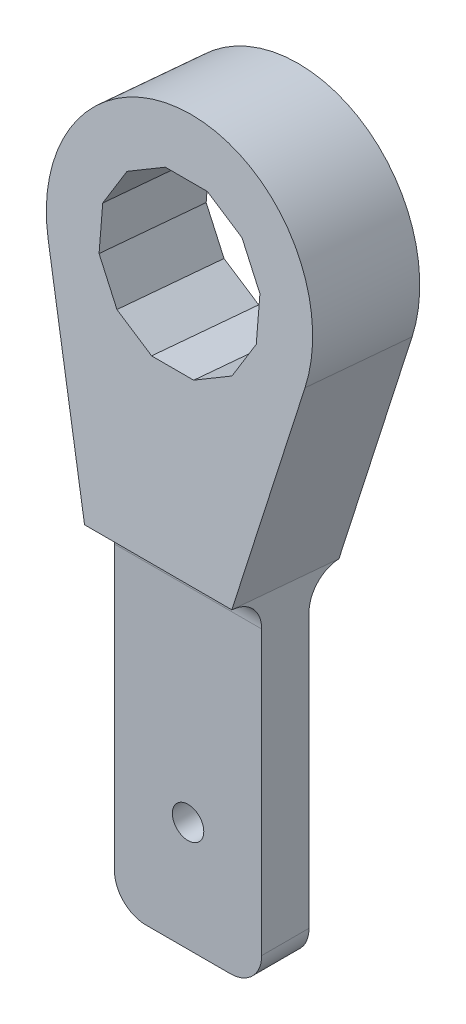
ISO-10303-21;
HEADER;
FILE_DESCRIPTION(('STEP AP214'),'2;1');
FILE_NAME('part.step','',(''),(''),'','','');
FILE_SCHEMA(('AUTOMOTIVE_DESIGN { 1 0 10303 214 1 1 1 1 }'));
ENDSEC;
DATA;
#1=APPLICATION_CONTEXT('core data for automotive mechanical design processes');
#2=APPLICATION_PROTOCOL_DEFINITION('international standard','automotive_design',2000,#1);
#3=PRODUCT_CONTEXT('',#1,'mechanical');
#4=PRODUCT('Part','Part','',(#3));
#5=PRODUCT_RELATED_PRODUCT_CATEGORY('part','',(#4));
#6=PRODUCT_DEFINITION_FORMATION('','',#4);
#7=PRODUCT_DEFINITION_CONTEXT('part definition',#1,'design');
#8=PRODUCT_DEFINITION('design','',#6,#7);
#9=PRODUCT_DEFINITION_SHAPE('','',#8);
#10=(LENGTH_UNIT() NAMED_UNIT(*) SI_UNIT(.MILLI.,.METRE.));
#11=(NAMED_UNIT(*) PLANE_ANGLE_UNIT() SI_UNIT($,.RADIAN.));
#12=(NAMED_UNIT(*) SI_UNIT($,.STERADIAN.) SOLID_ANGLE_UNIT());
#13=UNCERTAINTY_MEASURE_WITH_UNIT(LENGTH_MEASURE(1.E-05),#10,'distance_accuracy_value','');
#14=(GEOMETRIC_REPRESENTATION_CONTEXT(3) GLOBAL_UNCERTAINTY_ASSIGNED_CONTEXT((#13)) GLOBAL_UNIT_ASSIGNED_CONTEXT((#10,
#11,#12)) REPRESENTATION_CONTEXT('',''));
#15=CARTESIAN_POINT('',(0.,0.,0.));
#16=DIRECTION('',(0.,0.,1.));
#17=DIRECTION('',(1.,0.,0.));
#18=AXIS2_PLACEMENT_3D('',#15,#16,#17);
#19=CARTESIAN_POINT('',(10.7188,-57.9254621447862,4.56785703894863));
#20=DIRECTION('',(0.,0.,-1.));
#21=DIRECTION('',(0.,1.,0.));
#22=AXIS2_PLACEMENT_3D('',#19,#20,#21);
#23=PLANE('',#22);
#24=CARTESIAN_POINT('',(0.,-49.0469564859104,4.56785703894864));
#25=DIRECTION('',(0.,0.,1.));
#26=DIRECTION('',(1.,0.,0.));
#27=AXIS2_PLACEMENT_3D('',#24,#25,#26);
#28=CIRCLE('',#27,1.26999999999999);
#29=CARTESIAN_POINT('',(1.26999999999999,-49.0469564859104,4.56785703894864));
#30=VERTEX_POINT('',#29);
#31=EDGE_CURVE('E221',#30,#30,#28,.T.);
#32=ORIENTED_EDGE('',*,*,#31,.F.);
#33=EDGE_LOOP('',(#32));
#34=FACE_BOUND('',#33,.T.);
#35=DIRECTION('',(-1.,0.,0.));
#36=VECTOR('',#35,1.);
#37=CARTESIAN_POINT('',(10.7188,-57.9254621447862,4.56785703894863));
#38=LINE('',#37,#36);
#39=CARTESIAN_POINT('',(3.40995,-57.9254621447862,4.56785703894863));
#40=VERTEX_POINT('',#39);
#41=CARTESIAN_POINT('',(-3.40995,-57.9254621447862,4.56785703894863));
#42=VERTEX_POINT('',#41);
#43=EDGE_CURVE('E350',#40,#42,#38,.T.);
#44=ORIENTED_EDGE('',*,*,#43,.F.);
#45=CARTESIAN_POINT('',(3.40995,-55.3854621447862,4.56785703894864));
#46=DIRECTION('',(0.,0.,-1.));
#47=DIRECTION('',(0.,1.,0.));
#48=AXIS2_PLACEMENT_3D('',#45,#46,#47);
#49=CIRCLE('',#48,2.54);
#50=CARTESIAN_POINT('',(5.94995,-55.3854621447862,4.56785703894863));
#51=VERTEX_POINT('',#50);
#52=EDGE_CURVE('E45',#40,#51,#49,.F.);
#53=ORIENTED_EDGE('',*,*,#52,.T.);
#54=DIRECTION('',(0.,-1.,0.));
#55=VECTOR('',#54,1.);
#56=CARTESIAN_POINT('',(5.94995,-57.9254621447862,4.56785703894863));
#57=LINE('',#56,#55);
#58=CARTESIAN_POINT('',(5.94995,-32.5369564859104,4.56785703894864));
#59=VERTEX_POINT('',#58);
#60=EDGE_CURVE('E238',#59,#51,#57,.T.);
#61=ORIENTED_EDGE('',*,*,#60,.F.);
#62=DIRECTION('',(-1.,0.,0.));
#63=VECTOR('',#62,1.);
#64=CARTESIAN_POINT('',(-5.94995,-32.5369564859104,4.56785703894864));
#65=LINE('',#64,#63);
#66=CARTESIAN_POINT('',(-5.94995,-32.5369564859104,4.56785703894864));
#67=VERTEX_POINT('',#66);
#68=EDGE_CURVE('E360',#59,#67,#65,.T.);
#69=ORIENTED_EDGE('',*,*,#68,.T.);
#70=DIRECTION('',(0.,1.,0.));
#71=VECTOR('',#70,1.);
#72=CARTESIAN_POINT('',(-5.94994999999999,-57.9254621447862,4.56785703894863));
#73=LINE('',#72,#71);
#74=CARTESIAN_POINT('',(-5.94994999999999,-55.3854621447862,4.56785703894863));
#75=VERTEX_POINT('',#74);
#76=EDGE_CURVE('E233',#75,#67,#73,.T.);
#77=ORIENTED_EDGE('',*,*,#76,.F.);
#78=CARTESIAN_POINT('',(-3.40995,-55.3854621447862,4.56785703894863));
#79=DIRECTION('',(0.,0.,-1.));
#80=DIRECTION('',(0.,1.,0.));
#81=AXIS2_PLACEMENT_3D('',#78,#79,#80);
#82=CIRCLE('',#81,2.54);
#83=EDGE_CURVE('E52',#75,#42,#82,.F.);
#84=ORIENTED_EDGE('',*,*,#83,.T.);
#85=EDGE_LOOP('',(#44,#53,#61,#69,#77,#84));
#86=FACE_BOUND('',#85,.T.);
#87=ADVANCED_FACE('F37',(#34,#86),#23,.F.);
#88=CARTESIAN_POINT('',(10.7188,-57.9254621447862,4.56785703894863));
#89=DIRECTION('',(0.,1.,0.));
#90=DIRECTION('',(0.,0.,1.));
#91=AXIS2_PLACEMENT_3D('',#88,#89,#90);
#92=PLANE('',#91);
#93=DIRECTION('',(-1.,0.,0.));
#94=VECTOR('',#93,1.);
#95=CARTESIAN_POINT('',(10.7188,-57.9254621447862,0.745157038948635));
#96=LINE('',#95,#94);
#97=CARTESIAN_POINT('',(3.40995,-57.9254621447862,0.745157038948635));
#98=VERTEX_POINT('',#97);
#99=CARTESIAN_POINT('',(-3.40995,-57.9254621447862,0.745157038948635));
#100=VERTEX_POINT('',#99);
#101=EDGE_CURVE('E347',#98,#100,#96,.T.);
#102=ORIENTED_EDGE('',*,*,#101,.F.);
#103=DIRECTION('',(0.,0.,-1.));
#104=VECTOR('',#103,1.);
#105=CARTESIAN_POINT('',(3.40995,-57.9254621447862,4.56785703894879));
#106=LINE('',#105,#104);
#107=EDGE_CURVE('E383',#98,#40,#106,.F.);
#108=ORIENTED_EDGE('',*,*,#107,.T.);
#109=ORIENTED_EDGE('',*,*,#43,.T.);
#110=DIRECTION('',(0.,0.,1.));
#111=VECTOR('',#110,1.);
#112=CARTESIAN_POINT('',(-3.40995,-57.9254621447862,0.745157038948636));
#113=LINE('',#112,#111);
#114=EDGE_CURVE('E381',#42,#100,#113,.F.);
#115=ORIENTED_EDGE('',*,*,#114,.T.);
#116=EDGE_LOOP('',(#102,#108,#109,#115));
#117=FACE_BOUND('',#116,.T.);
#118=ADVANCED_FACE('F401',(#117),#92,.F.);
#119=CARTESIAN_POINT('',(10.7188,-57.9254621447862,0.745157038948635));
#120=DIRECTION('',(0.,0.,1.));
#121=DIRECTION('',(0.,-1.,0.));
#122=AXIS2_PLACEMENT_3D('',#119,#120,#121);
#123=PLANE('',#122);
#124=CARTESIAN_POINT('',(0.,-49.0469564859104,0.745157038948637));
#125=DIRECTION('',(0.,0.,1.));
#126=DIRECTION('',(0.,-1.,0.));
#127=AXIS2_PLACEMENT_3D('',#124,#125,#126);
#128=CIRCLE('',#127,1.26999999999999);
#129=CARTESIAN_POINT('',(0.,-50.3169564859104,0.745157038948636));
#130=VERTEX_POINT('',#129);
#131=EDGE_CURVE('E218',#130,#130,#128,.T.);
#132=ORIENTED_EDGE('',*,*,#131,.T.);
#133=EDGE_LOOP('',(#132));
#134=FACE_BOUND('',#133,.T.);
#135=DIRECTION('',(0.,1.,0.));
#136=VECTOR('',#135,1.);
#137=CARTESIAN_POINT('',(5.94995,-57.9254621447862,0.745157038948635));
#138=LINE('',#137,#136);
#139=CARTESIAN_POINT('',(5.94995,-55.3854621447862,0.745157038948636));
#140=VERTEX_POINT('',#139);
#141=CARTESIAN_POINT('',(5.94995,-33.2795146677732,0.745157038948637));
#142=VERTEX_POINT('',#141);
#143=EDGE_CURVE('E241',#140,#142,#138,.T.);
#144=ORIENTED_EDGE('',*,*,#143,.F.);
#145=CARTESIAN_POINT('',(3.40995,-55.3854621447862,0.745157038948636));
#146=DIRECTION('',(0.,0.,1.));
#147=DIRECTION('',(0.,-1.,0.));
#148=AXIS2_PLACEMENT_3D('',#145,#146,#147);
#149=CIRCLE('',#148,2.54);
#150=EDGE_CURVE('E379',#140,#98,#149,.F.);
#151=ORIENTED_EDGE('',*,*,#150,.T.);
#152=ORIENTED_EDGE('',*,*,#101,.T.);
#153=CARTESIAN_POINT('',(-3.40995,-55.3854621447862,0.745157038948636));
#154=DIRECTION('',(0.,0.,1.));
#155=DIRECTION('',(0.,-1.,0.));
#156=AXIS2_PLACEMENT_3D('',#153,#154,#155);
#157=CIRCLE('',#156,2.54);
#158=CARTESIAN_POINT('',(-5.94994999999999,-55.3854621447862,0.745157038948636));
#159=VERTEX_POINT('',#158);
#160=EDGE_CURVE('E377',#100,#159,#157,.F.);
#161=ORIENTED_EDGE('',*,*,#160,.T.);
#162=DIRECTION('',(0.,-1.,0.));
#163=VECTOR('',#162,1.);
#164=CARTESIAN_POINT('',(-5.94994999999999,-57.9254621447862,0.745157038948635));
#165=LINE('',#164,#163);
#166=CARTESIAN_POINT('',(-5.94995,-33.2795146677732,0.745157038948637));
#167=VERTEX_POINT('',#166);
#168=EDGE_CURVE('E235',#167,#159,#165,.T.);
#169=ORIENTED_EDGE('',*,*,#168,.F.);
#170=DIRECTION('',(1.,0.,0.));
#171=VECTOR('',#170,1.);
#172=CARTESIAN_POINT('',(10.7188,-33.2795146677732,0.745157038948637));
#173=LINE('',#172,#171);
#174=EDGE_CURVE('E357',#167,#142,#173,.T.);
#175=ORIENTED_EDGE('',*,*,#174,.T.);
#176=EDGE_LOOP('',(#144,#151,#152,#161,#169,#175));
#177=FACE_BOUND('',#176,.T.);
#178=ADVANCED_FACE('F398',(#134,#177),#123,.F.);
#179=CARTESIAN_POINT('',(10.7188,-30.7425666508866,-1.67036501274305));
#180=DIRECTION('',(0.,0.0871557427476587,0.996194698091745));
#181=DIRECTION('',(0.,-0.996194698091746,0.0871557427476587));
#182=AXIS2_PLACEMENT_3D('',#179,#180,#181);
#183=PLANE('',#182);
#184=DIRECTION('',(0.,0.996194698091746,-0.0871557427476587));
#185=VECTOR('',#184,1.);
#186=CARTESIAN_POINT('',(6.35000000000002,-30.7425666508866,-1.67036501274305));
#187=LINE('',#186,#185);
#188=CARTESIAN_POINT('',(6.35000000000001,-12.7515667198033,-3.24437355220853));
#189=VERTEX_POINT('',#188);
#190=CARTESIAN_POINT('',(6.35,-9.36156124610865,-3.54096060044764));
#191=VERTEX_POINT('',#190);
#192=EDGE_CURVE('E337',#189,#191,#187,.T.);
#193=ORIENTED_EDGE('',*,*,#192,.T.);
#194=DIRECTION('',(-0.500000000000001,0.86272991566282,-0.0754790873051737));
#195=VECTOR('',#194,1.);
#196=CARTESIAN_POINT('',(16.7358119186637,-27.2818625274659,-1.97313739135978));
#197=LINE('',#196,#195);
#198=CARTESIAN_POINT('',(4.64852262806236,-6.42573038692074,-3.79781251865616));
#199=VERTEX_POINT('',#198);
#200=EDGE_CURVE('E340',#191,#199,#197,.T.);
#201=ORIENTED_EDGE('',*,*,#200,.T.);
#202=DIRECTION('',(-0.866025403784439,0.498097349045872,-0.0435778713738293));
#203=VECTOR('',#202,1.);
#204=CARTESIAN_POINT('',(19.7709506046325,-15.123444395483,-3.03686114431633));
#205=LINE('',#204,#203);
#206=CARTESIAN_POINT('',(1.70147737193763,-4.7307276500734,-3.94610604277572));
#207=VERTEX_POINT('',#206);
#208=EDGE_CURVE('E285',#199,#207,#205,.T.);
#209=ORIENTED_EDGE('',*,*,#208,.T.);
#210=DIRECTION('',(-1.,0.,0.));
#211=VECTOR('',#210,1.);
#212=CARTESIAN_POINT('',(10.7188,-4.7307276500734,-3.94610604277572));
#213=LINE('',#212,#211);
#214=CARTESIAN_POINT('',(-1.70147737193763,-4.7307276500734,-3.94610604277572));
#215=VERTEX_POINT('',#214);
#216=EDGE_CURVE('E310',#207,#215,#213,.T.);
#217=ORIENTED_EDGE('',*,*,#216,.T.);
#218=DIRECTION('',(-0.866025403784438,-0.498097349045873,0.0435778713738294));
#219=VECTOR('',#218,1.);
#220=CARTESIAN_POINT('',(-3.69275060463254,-5.87601497547641,-3.84590638532303));
#221=LINE('',#220,#219);
#222=CARTESIAN_POINT('',(-4.64852262806238,-6.42573038692075,-3.79781251865616));
#223=VERTEX_POINT('',#222);
#224=EDGE_CURVE('E313',#215,#223,#221,.T.);
#225=ORIENTED_EDGE('',*,*,#224,.T.);
#226=DIRECTION('',(-0.499999999999999,-0.862729915662821,0.0754790873051738));
#227=VECTOR('',#226,1.);
#228=CARTESIAN_POINT('',(-11.3764119186637,-18.0344331074593,-2.78218263236647));
#229=LINE('',#228,#227);
#230=CARTESIAN_POINT('',(-6.35,-9.36156124610864,-3.54096060044764));
#231=VERTEX_POINT('',#230);
#232=EDGE_CURVE('E316',#223,#231,#229,.T.);
#233=ORIENTED_EDGE('',*,*,#232,.T.);
#234=DIRECTION('',(0.,-0.996194698091746,0.0871557427476587));
#235=VECTOR('',#234,1.);
#236=CARTESIAN_POINT('',(-6.34999999999999,-30.7425666508866,-1.67036501274305));
#237=LINE('',#236,#235);
#238=CARTESIAN_POINT('',(-6.35,-12.7515667198033,-3.24437355220853));
#239=VERTEX_POINT('',#238);
#240=EDGE_CURVE('E319',#231,#239,#237,.T.);
#241=ORIENTED_EDGE('',*,*,#240,.T.);
#242=DIRECTION('',(0.500000000000001,-0.862729915662821,0.0754790873051738));
#243=VECTOR('',#242,1.);
#244=CARTESIAN_POINT('',(5.73728929060135,-33.6076988603485,-1.41969842491214));
#245=LINE('',#244,#243);
#246=CARTESIAN_POINT('',(-4.64852262806237,-15.6873975789912,-2.98752163400001));
#247=VERTEX_POINT('',#246);
#248=EDGE_CURVE('E322',#239,#247,#245,.T.);
#249=ORIENTED_EDGE('',*,*,#248,.T.);
#250=DIRECTION('',(0.866025403784439,-0.498097349045872,0.0435778713738293));
#251=VECTOR('',#250,1.);
#252=CARTESIAN_POINT('',(13.4209506046325,-26.0801143244009,-2.07827673554062));
#253=LINE('',#252,#251);
#254=CARTESIAN_POINT('',(-1.70147737193763,-17.3824003158386,-2.83922810988045));
#255=VERTEX_POINT('',#254);
#256=EDGE_CURVE('E325',#247,#255,#253,.T.);
#257=ORIENTED_EDGE('',*,*,#256,.T.);
#258=DIRECTION('',(1.,0.,0.));
#259=VECTOR('',#258,1.);
#260=CARTESIAN_POINT('',(10.7188,-17.3824003158386,-2.83922810988045));
#261=LINE('',#260,#259);
#262=CARTESIAN_POINT('',(1.70147737193763,-17.3824003158386,-2.83922810988045));
#263=VERTEX_POINT('',#262);
#264=EDGE_CURVE('E328',#255,#263,#261,.T.);
#265=ORIENTED_EDGE('',*,*,#264,.T.);
#266=DIRECTION('',(0.866025403784439,0.498097349045873,-0.0435778713738294));
#267=VECTOR('',#266,1.);
#268=CARTESIAN_POINT('',(2.65724939536748,-16.8326849043942,-2.88732197654732));
#269=LINE('',#268,#267);
#270=CARTESIAN_POINT('',(4.64852262806238,-15.6873975789912,-2.98752163400001));
#271=VERTEX_POINT('',#270);
#272=EDGE_CURVE('E331',#263,#271,#269,.T.);
#273=ORIENTED_EDGE('',*,*,#272,.T.);
#274=DIRECTION('',(0.5,0.862729915662821,-0.0754790873051738));
#275=VECTOR('',#274,1.);
#276=CARTESIAN_POINT('',(-0.37788929060133,-24.3602694403419,-2.22874366591884));
#277=LINE('',#276,#275);
#278=EDGE_CURVE('E334',#271,#189,#277,.T.);
#279=ORIENTED_EDGE('',*,*,#278,.T.);
#280=EDGE_LOOP('',(#193,#201,#209,#217,#225,#233,#241,#249,#257,#265,#273,#279));
#281=FACE_BOUND('',#280,.T.);
#282=DIRECTION('',(0.250959603355477,-0.964314037715792,0.0843665463790427));
#283=VECTOR('',#282,1.);
#284=CARTESIAN_POINT('',(-4.90014008155578,-34.7764686325337,-1.31744431957417));
#285=LINE('',#284,#283);
#286=CARTESIAN_POINT('',(-10.3757722534236,-13.7363135713183,-3.15821936625812));
#287=VERTEX_POINT('',#286);
#288=CARTESIAN_POINT('',(-5.94995,-30.7425666508866,-1.67036501274306));
#289=VERTEX_POINT('',#288);
#290=EDGE_CURVE('E244',#287,#289,#285,.T.);
#291=ORIENTED_EDGE('',*,*,#290,.F.);
#292=CARTESIAN_POINT('',(0.,-11.056563982956,-3.39266707632808));
#293=DIRECTION('',(0.,0.0871557427476587,0.996194698091745));
#294=DIRECTION('',(0.,-0.996194698091746,0.0871557427476587));
#295=AXIS2_PLACEMENT_3D('',#292,#293,#294);
#296=CIRCLE('',#295,10.7188);
#297=CARTESIAN_POINT('',(10.3757722534236,-13.7363135713183,-3.15821936625812));
#298=VERTEX_POINT('',#297);
#299=EDGE_CURVE('E229',#298,#287,#296,.T.);
#300=ORIENTED_EDGE('',*,*,#299,.F.);
#301=DIRECTION('',(0.250959603355477,0.964314037715792,-0.0843665463790427));
#302=VECTOR('',#301,1.);
#303=CARTESIAN_POINT('',(6.25029561857204,-29.5884865029944,-1.77133394248394));
#304=LINE('',#303,#302);
#305=CARTESIAN_POINT('',(5.94995,-30.7425666508866,-1.67036501274305));
#306=VERTEX_POINT('',#305);
#307=EDGE_CURVE('E211',#306,#298,#304,.T.);
#308=ORIENTED_EDGE('',*,*,#307,.F.);
#309=DIRECTION('',(-1.,0.,0.));
#310=VECTOR('',#309,1.);
#311=CARTESIAN_POINT('',(10.7188,-30.7425666508866,-1.67036501274305));
#312=LINE('',#311,#310);
#313=EDGE_CURVE('E344',#306,#289,#312,.T.);
#314=ORIENTED_EDGE('',*,*,#313,.T.);
#315=EDGE_LOOP('',(#291,#300,#308,#314));
#316=FACE_BOUND('',#315,.T.);
#317=ADVANCED_FACE('F415',(#281,#316),#183,.F.);
#318=CARTESIAN_POINT('',(10.7188,-29.9854621447862,6.98337909064032));
#319=DIRECTION('',(0.,-0.0871557427476587,-0.996194698091745));
#320=DIRECTION('',(0.,0.996194698091746,-0.0871557427476587));
#321=AXIS2_PLACEMENT_3D('',#318,#319,#320);
#322=PLANE('',#321);
#323=DIRECTION('',(-0.866025403784439,0.498097349045872,-0.0435778713738296));
#324=VECTOR('',#323,1.);
#325=CARTESIAN_POINT('',(4.64852262806236,-5.66862588082037,4.85593158472722));
#326=LINE('',#325,#324);
#327=CARTESIAN_POINT('',(4.64852262806236,-5.66862588082037,4.85593158472722));
#328=VERTEX_POINT('',#327);
#329=CARTESIAN_POINT('',(1.70147737193763,-3.97362314397303,4.70763806060766));
#330=VERTEX_POINT('',#329);
#331=EDGE_CURVE('E249',#328,#330,#326,.T.);
#332=ORIENTED_EDGE('',*,*,#331,.F.);
#333=DIRECTION('',(-0.500000000000001,0.86272991566282,-0.0754790873051739));
#334=VECTOR('',#333,1.);
#335=CARTESIAN_POINT('',(6.35,-8.60445674000828,5.11278350293574));
#336=LINE('',#335,#334);
#337=CARTESIAN_POINT('',(6.35,-8.60445674000828,5.11278350293574));
#338=VERTEX_POINT('',#337);
#339=EDGE_CURVE('E247',#338,#328,#336,.T.);
#340=ORIENTED_EDGE('',*,*,#339,.F.);
#341=DIRECTION('',(0.,0.996194698091746,-0.0871557427476592));
#342=VECTOR('',#341,1.);
#343=CARTESIAN_POINT('',(6.35000000000001,-11.994462213703,5.40937055117485));
#344=LINE('',#343,#342);
#345=CARTESIAN_POINT('',(6.35000000000001,-11.994462213703,5.40937055117485));
#346=VERTEX_POINT('',#345);
#347=EDGE_CURVE('E279',#346,#338,#344,.T.);
#348=ORIENTED_EDGE('',*,*,#347,.F.);
#349=DIRECTION('',(0.499999999999999,0.862729915662821,-0.075479087305174));
#350=VECTOR('',#349,1.);
#351=CARTESIAN_POINT('',(4.64852262806238,-14.9302930728909,5.66622246938337));
#352=LINE('',#351,#350);
#353=CARTESIAN_POINT('',(4.64852262806238,-14.9302930728909,5.66622246938337));
#354=VERTEX_POINT('',#353);
#355=EDGE_CURVE('E276',#354,#346,#352,.T.);
#356=ORIENTED_EDGE('',*,*,#355,.F.);
#357=DIRECTION('',(0.866025403784439,0.498097349045873,-0.0435778713738296));
#358=VECTOR('',#357,1.);
#359=CARTESIAN_POINT('',(1.70147737193763,-16.6252958097382,5.81451599350293));
#360=LINE('',#359,#358);
#361=CARTESIAN_POINT('',(1.70147737193763,-16.6252958097382,5.81451599350293));
#362=VERTEX_POINT('',#361);
#363=EDGE_CURVE('E273',#362,#354,#360,.T.);
#364=ORIENTED_EDGE('',*,*,#363,.F.);
#365=DIRECTION('',(1.,0.,0.));
#366=VECTOR('',#365,1.);
#367=CARTESIAN_POINT('',(-1.70147737193763,-16.6252958097382,5.81451599350293));
#368=LINE('',#367,#366);
#369=CARTESIAN_POINT('',(-1.70147737193763,-16.6252958097382,5.81451599350293));
#370=VERTEX_POINT('',#369);
#371=EDGE_CURVE('E270',#370,#362,#368,.T.);
#372=ORIENTED_EDGE('',*,*,#371,.F.);
#373=DIRECTION('',(0.866025403784439,-0.498097349045872,0.0435778713738297));
#374=VECTOR('',#373,1.);
#375=CARTESIAN_POINT('',(-4.64852262806236,-14.9302930728909,5.66622246938337));
#376=LINE('',#375,#374);
#377=CARTESIAN_POINT('',(-4.64852262806236,-14.9302930728909,5.66622246938337));
#378=VERTEX_POINT('',#377);
#379=EDGE_CURVE('E267',#378,#370,#376,.T.);
#380=ORIENTED_EDGE('',*,*,#379,.F.);
#381=DIRECTION('',(0.500000000000001,-0.86272991566282,0.0754790873051738));
#382=VECTOR('',#381,1.);
#383=CARTESIAN_POINT('',(-6.35,-11.994462213703,5.40937055117485));
#384=LINE('',#383,#382);
#385=CARTESIAN_POINT('',(-6.35,-11.994462213703,5.40937055117485));
#386=VERTEX_POINT('',#385);
#387=EDGE_CURVE('E264',#386,#378,#384,.T.);
#388=ORIENTED_EDGE('',*,*,#387,.F.);
#389=DIRECTION('',(0.,-0.996194698091745,0.0871557427476591));
#390=VECTOR('',#389,1.);
#391=CARTESIAN_POINT('',(-6.35,-8.60445674000828,5.11278350293574));
#392=LINE('',#391,#390);
#393=CARTESIAN_POINT('',(-6.35,-8.60445674000828,5.11278350293574));
#394=VERTEX_POINT('',#393);
#395=EDGE_CURVE('E261',#394,#386,#392,.T.);
#396=ORIENTED_EDGE('',*,*,#395,.F.);
#397=DIRECTION('',(-0.499999999999999,-0.862729915662821,0.0754790873051743));
#398=VECTOR('',#397,1.);
#399=CARTESIAN_POINT('',(-4.64852262806238,-5.66862588082038,4.85593158472722));
#400=LINE('',#399,#398);
#401=CARTESIAN_POINT('',(-4.64852262806238,-5.66862588082038,4.85593158472722));
#402=VERTEX_POINT('',#401);
#403=EDGE_CURVE('E258',#402,#394,#400,.T.);
#404=ORIENTED_EDGE('',*,*,#403,.F.);
#405=DIRECTION('',(-0.866025403784438,-0.498097349045873,0.0435778713738295));
#406=VECTOR('',#405,1.);
#407=CARTESIAN_POINT('',(-1.70147737193763,-3.97362314397303,4.70763806060766));
#408=LINE('',#407,#406);
#409=CARTESIAN_POINT('',(-1.70147737193763,-3.97362314397303,4.70763806060766));
#410=VERTEX_POINT('',#409);
#411=EDGE_CURVE('E255',#410,#402,#408,.T.);
#412=ORIENTED_EDGE('',*,*,#411,.F.);
#413=DIRECTION('',(-1.,0.,0.));
#414=VECTOR('',#413,1.);
#415=CARTESIAN_POINT('',(1.70147737193763,-3.97362314397303,4.70763806060766));
#416=LINE('',#415,#414);
#417=EDGE_CURVE('E252',#330,#410,#416,.T.);
#418=ORIENTED_EDGE('',*,*,#417,.F.);
#419=EDGE_LOOP('',(#332,#340,#348,#356,#364,#372,#380,#388,#396,#404,#412,#418));
#420=FACE_BOUND('',#419,.T.);
#421=DIRECTION('',(0.250959603355477,-0.964314037715792,0.084366546379043));
#422=VECTOR('',#421,1.);
#423=CARTESIAN_POINT('',(-5.94995,-29.9854621447862,6.98337909064034));
#424=LINE('',#423,#422);
#425=CARTESIAN_POINT('',(-10.3757722534236,-12.9792090652179,5.49552473712526));
#426=VERTEX_POINT('',#425);
#427=CARTESIAN_POINT('',(-5.94995,-29.9854621447862,6.98337909064034));
#428=VERTEX_POINT('',#427);
#429=EDGE_CURVE('E203',#426,#428,#424,.T.);
#430=ORIENTED_EDGE('',*,*,#429,.T.);
#431=DIRECTION('',(-1.,0.,0.));
#432=VECTOR('',#431,1.);
#433=CARTESIAN_POINT('',(10.7188,-29.9854621447862,6.98337909064032));
#434=LINE('',#433,#432);
#435=CARTESIAN_POINT('',(5.94995,-29.9854621447862,6.98337909064034));
#436=VERTEX_POINT('',#435);
#437=EDGE_CURVE('E217',#436,#428,#434,.T.);
#438=ORIENTED_EDGE('',*,*,#437,.F.);
#439=DIRECTION('',(0.250959603355477,0.964314037715792,-0.084366546379043));
#440=VECTOR('',#439,1.);
#441=CARTESIAN_POINT('',(5.94995,-29.9854621447862,6.98337909064034));
#442=LINE('',#441,#440);
#443=CARTESIAN_POINT('',(10.3757722534236,-12.9792090652179,5.49552473712526));
#444=VERTEX_POINT('',#443);
#445=EDGE_CURVE('E204',#436,#444,#442,.T.);
#446=ORIENTED_EDGE('',*,*,#445,.T.);
#447=CARTESIAN_POINT('',(0.,-10.2994594768556,5.2610770270553));
#448=DIRECTION('',(0.,0.0871557427476591,0.996194698091746));
#449=DIRECTION('',(0.,0.996194698091746,-0.0871557427476591));
#450=AXIS2_PLACEMENT_3D('',#447,#448,#449);
#451=CIRCLE('',#450,10.7188);
#452=EDGE_CURVE('E192',#444,#426,#451,.T.);
#453=ORIENTED_EDGE('',*,*,#452,.T.);
#454=EDGE_LOOP('',(#430,#438,#446,#453));
#455=FACE_BOUND('',#454,.T.);
#456=ADVANCED_FACE('F215',(#420,#455),#322,.F.);
#457=CARTESIAN_POINT('',(10.7188,-30.3640143978364,4.56785703894864));
#458=DIRECTION('',(0.,0.987941630116979,-0.15482679187339));
#459=DIRECTION('',(0.,0.15482679187339,0.987941630116979));
#460=AXIS2_PLACEMENT_3D('',#457,#458,#459);
#461=PLANE('',#460);
#462=DIRECTION('',(0.,0.15482679187339,0.987941630116979));
#463=VECTOR('',#462,1.);
#464=CARTESIAN_POINT('',(-5.94995,-30.3640143978364,4.56785703894864));
#465=LINE('',#464,#463);
#466=CARTESIAN_POINT('',(-5.94995,-30.0275847454132,6.71459698759023));
#467=VERTEX_POINT('',#466);
#468=EDGE_CURVE('E352',#467,#428,#465,.T.);
#469=ORIENTED_EDGE('',*,*,#468,.F.);
#470=DIRECTION('',(-1.,0.,0.));
#471=VECTOR('',#470,1.);
#472=CARTESIAN_POINT('',(5.94995,-30.0275847454132,6.71459698759023));
#473=LINE('',#472,#471);
#474=CARTESIAN_POINT('',(5.94995,-30.0275847454132,6.71459698759023));
#475=VERTEX_POINT('',#474);
#476=EDGE_CURVE('E363',#467,#475,#473,.F.);
#477=ORIENTED_EDGE('',*,*,#476,.T.);
#478=DIRECTION('',(0.,-0.15482679187339,-0.987941630116979));
#479=VECTOR('',#478,1.);
#480=CARTESIAN_POINT('',(5.94995,-30.3640143978364,4.56785703894864));
#481=LINE('',#480,#479);
#482=EDGE_CURVE('E354',#436,#475,#481,.T.);
#483=ORIENTED_EDGE('',*,*,#482,.F.);
#484=ORIENTED_EDGE('',*,*,#437,.T.);
#485=EDGE_LOOP('',(#469,#477,#483,#484));
#486=FACE_BOUND('',#485,.T.);
#487=ADVANCED_FACE('F422',(#486),#461,.F.);
#488=CARTESIAN_POINT('',(6.35,-9.79869468033839,-8.5374186169792));
#489=DIRECTION('',(0.866025403784438,0.498097349045874,-0.0435778713738296));
#490=DIRECTION('',(-0.498570974847159,0.866848881316665,0.));
#491=AXIS2_PLACEMENT_3D('',#488,#489,#490);
#492=PLANE('',#491);
#493=DIRECTION('',(0.,0.087155742747659,0.996194698091745));
#494=VECTOR('',#493,1.);
#495=CARTESIAN_POINT('',(6.35,-9.79869468033839,-8.5374186169792));
#496=LINE('',#495,#494);
#497=EDGE_CURVE('E283',#191,#338,#496,.T.);
#498=ORIENTED_EDGE('',*,*,#497,.T.);
#499=ORIENTED_EDGE('',*,*,#339,.T.);
#500=DIRECTION('',(0.,0.087155742747659,0.996194698091745));
#501=VECTOR('',#500,1.);
#502=CARTESIAN_POINT('',(4.64852262806236,-6.86286382115048,-8.79427053518772));
#503=LINE('',#502,#501);
#504=EDGE_CURVE('E282',#199,#328,#503,.T.);
#505=ORIENTED_EDGE('',*,*,#504,.F.);
#506=ORIENTED_EDGE('',*,*,#200,.F.);
#507=EDGE_LOOP('',(#498,#499,#505,#506));
#508=FACE_BOUND('',#507,.T.);
#509=ADVANCED_FACE('F424',(#508),#492,.F.);
#510=CARTESIAN_POINT('',(6.35000000000001,-13.1887001540331,-8.24083156874008));
#511=DIRECTION('',(1.,0.,0.));
#512=DIRECTION('',(0.,1.,0.));
#513=AXIS2_PLACEMENT_3D('',#510,#511,#512);
#514=PLANE('',#513);
#515=DIRECTION('',(0.,0.087155742747659,0.996194698091745));
#516=VECTOR('',#515,1.);
#517=CARTESIAN_POINT('',(6.35000000000001,-13.1887001540331,-8.24083156874008));
#518=LINE('',#517,#516);
#519=EDGE_CURVE('E286',#189,#346,#518,.T.);
#520=ORIENTED_EDGE('',*,*,#519,.T.);
#521=ORIENTED_EDGE('',*,*,#347,.T.);
#522=ORIENTED_EDGE('',*,*,#497,.F.);
#523=ORIENTED_EDGE('',*,*,#192,.F.);
#524=EDGE_LOOP('',(#520,#521,#522,#523));
#525=FACE_BOUND('',#524,.T.);
#526=ADVANCED_FACE('F430',(#525),#514,.F.);
#527=CARTESIAN_POINT('',(4.64852262806238,-16.124531013221,-7.98397965053156));
#528=DIRECTION('',(0.866025403784439,-0.498097349045872,0.0435778713738295));
#529=DIRECTION('',(0.498570974847158,0.866848881316666,0.));
#530=AXIS2_PLACEMENT_3D('',#527,#528,#529);
#531=PLANE('',#530);
#532=DIRECTION('',(0.,0.087155742747659,0.996194698091745));
#533=VECTOR('',#532,1.);
#534=CARTESIAN_POINT('',(4.64852262806238,-16.124531013221,-7.98397965053156));
#535=LINE('',#534,#533);
#536=EDGE_CURVE('E288',#271,#354,#535,.T.);
#537=ORIENTED_EDGE('',*,*,#536,.T.);
#538=ORIENTED_EDGE('',*,*,#355,.T.);
#539=ORIENTED_EDGE('',*,*,#519,.F.);
#540=ORIENTED_EDGE('',*,*,#278,.F.);
#541=EDGE_LOOP('',(#537,#538,#539,#540));
#542=FACE_BOUND('',#541,.T.);
#543=ADVANCED_FACE('F474',(#542),#531,.F.);
#544=CARTESIAN_POINT('',(1.70147737193763,-17.8195337500683,-7.835686126412));
#545=DIRECTION('',(0.5,-0.862729915662821,0.0754790873051741));
#546=DIRECTION('',(0.865197992448261,0.501430387854085,0.));
#547=AXIS2_PLACEMENT_3D('',#544,#545,#546);
#548=PLANE('',#547);
#549=DIRECTION('',(0.,0.087155742747659,0.996194698091745));
#550=VECTOR('',#549,1.);
#551=CARTESIAN_POINT('',(1.70147737193763,-17.8195337500683,-7.835686126412));
#552=LINE('',#551,#550);
#553=EDGE_CURVE('E290',#263,#362,#552,.T.);
#554=ORIENTED_EDGE('',*,*,#553,.T.);
#555=ORIENTED_EDGE('',*,*,#363,.T.);
#556=ORIENTED_EDGE('',*,*,#536,.F.);
#557=ORIENTED_EDGE('',*,*,#272,.F.);
#558=EDGE_LOOP('',(#554,#555,#556,#557));
#559=FACE_BOUND('',#558,.T.);
#560=ADVANCED_FACE('F478',(#559),#548,.F.);
#561=CARTESIAN_POINT('',(-1.70147737193763,-17.8195337500683,-7.835686126412));
#562=DIRECTION('',(0.,-0.996194698091745,0.087155742747659));
#563=DIRECTION('',(0.,-0.087155742747659,-0.996194698091745));
#564=AXIS2_PLACEMENT_3D('',#561,#562,#563);
#565=PLANE('',#564);
#566=DIRECTION('',(0.,0.087155742747659,0.996194698091745));
#567=VECTOR('',#566,1.);
#568=CARTESIAN_POINT('',(-1.70147737193763,-17.8195337500683,-7.835686126412));
#569=LINE('',#568,#567);
#570=EDGE_CURVE('E292',#255,#370,#569,.T.);
#571=ORIENTED_EDGE('',*,*,#570,.T.);
#572=ORIENTED_EDGE('',*,*,#371,.T.);
#573=ORIENTED_EDGE('',*,*,#553,.F.);
#574=ORIENTED_EDGE('',*,*,#264,.F.);
#575=EDGE_LOOP('',(#571,#572,#573,#574));
#576=FACE_BOUND('',#575,.T.);
#577=ADVANCED_FACE('F482',(#576),#565,.F.);
#578=CARTESIAN_POINT('',(-4.64852262806236,-16.124531013221,-7.98397965053156));
#579=DIRECTION('',(-0.499999999999999,-0.862729915662821,0.0754790873051741));
#580=DIRECTION('',(0.865197992448262,-0.501430387854085,0.));
#581=AXIS2_PLACEMENT_3D('',#578,#579,#580);
#582=PLANE('',#581);
#583=DIRECTION('',(0.,0.087155742747659,0.996194698091745));
#584=VECTOR('',#583,1.);
#585=CARTESIAN_POINT('',(-4.64852262806236,-16.124531013221,-7.98397965053156));
#586=LINE('',#585,#584);
#587=EDGE_CURVE('E294',#247,#378,#586,.T.);
#588=ORIENTED_EDGE('',*,*,#587,.T.);
#589=ORIENTED_EDGE('',*,*,#379,.T.);
#590=ORIENTED_EDGE('',*,*,#570,.F.);
#591=ORIENTED_EDGE('',*,*,#256,.F.);
#592=EDGE_LOOP('',(#588,#589,#590,#591));
#593=FACE_BOUND('',#592,.T.);
#594=ADVANCED_FACE('F486',(#593),#582,.F.);
#595=CARTESIAN_POINT('',(-6.35,-13.1887001540331,-8.24083156874008));
#596=DIRECTION('',(-0.866025403784438,-0.498097349045873,0.0435778713738296));
#597=DIRECTION('',(0.498570974847159,-0.866848881316665,0.));
#598=AXIS2_PLACEMENT_3D('',#595,#596,#597);
#599=PLANE('',#598);
#600=DIRECTION('',(0.,0.087155742747659,0.996194698091745));
#601=VECTOR('',#600,1.);
#602=CARTESIAN_POINT('',(-6.35,-13.1887001540331,-8.24083156874008));
#603=LINE('',#602,#601);
#604=EDGE_CURVE('E296',#239,#386,#603,.T.);
#605=ORIENTED_EDGE('',*,*,#604,.T.);
#606=ORIENTED_EDGE('',*,*,#387,.T.);
#607=ORIENTED_EDGE('',*,*,#587,.F.);
#608=ORIENTED_EDGE('',*,*,#248,.F.);
#609=EDGE_LOOP('',(#605,#606,#607,#608));
#610=FACE_BOUND('',#609,.T.);
#611=ADVANCED_FACE('F490',(#610),#599,.F.);
#612=CARTESIAN_POINT('',(-6.35,-9.79869468033839,-8.5374186169792));
#613=DIRECTION('',(-1.,0.,0.));
#614=DIRECTION('',(0.,-1.,0.));
#615=AXIS2_PLACEMENT_3D('',#612,#613,#614);
#616=PLANE('',#615);
#617=DIRECTION('',(0.,0.087155742747659,0.996194698091745));
#618=VECTOR('',#617,1.);
#619=CARTESIAN_POINT('',(-6.35,-9.79869468033839,-8.5374186169792));
#620=LINE('',#619,#618);
#621=EDGE_CURVE('E298',#231,#394,#620,.T.);
#622=ORIENTED_EDGE('',*,*,#621,.T.);
#623=ORIENTED_EDGE('',*,*,#395,.T.);
#624=ORIENTED_EDGE('',*,*,#604,.F.);
#625=ORIENTED_EDGE('',*,*,#240,.F.);
#626=EDGE_LOOP('',(#622,#623,#624,#625));
#627=FACE_BOUND('',#626,.T.);
#628=ADVANCED_FACE('F494',(#627),#616,.F.);
#629=CARTESIAN_POINT('',(-4.64852262806238,-6.86286382115049,-8.79427053518772));
#630=DIRECTION('',(-0.866025403784439,0.498097349045872,-0.0435778713738295));
#631=DIRECTION('',(-0.498570974847157,-0.866848881316666,0.));
#632=AXIS2_PLACEMENT_3D('',#629,#630,#631);
#633=PLANE('',#632);
#634=DIRECTION('',(0.,0.087155742747659,0.996194698091745));
#635=VECTOR('',#634,1.);
#636=CARTESIAN_POINT('',(-4.64852262806238,-6.86286382115049,-8.79427053518772));
#637=LINE('',#636,#635);
#638=EDGE_CURVE('E300',#223,#402,#637,.T.);
#639=ORIENTED_EDGE('',*,*,#638,.T.);
#640=ORIENTED_EDGE('',*,*,#403,.T.);
#641=ORIENTED_EDGE('',*,*,#621,.F.);
#642=ORIENTED_EDGE('',*,*,#232,.F.);
#643=EDGE_LOOP('',(#639,#640,#641,#642));
#644=FACE_BOUND('',#643,.T.);
#645=ADVANCED_FACE('F498',(#644),#633,.F.);
#646=CARTESIAN_POINT('',(-1.70147737193763,-5.16786108430314,-8.94256405930727));
#647=DIRECTION('',(-0.500000000000001,0.86272991566282,-0.0754790873051741));
#648=DIRECTION('',(-0.865197992448261,-0.501430387854086,0.));
#649=AXIS2_PLACEMENT_3D('',#646,#647,#648);
#650=PLANE('',#649);
#651=DIRECTION('',(0.,0.087155742747659,0.996194698091745));
#652=VECTOR('',#651,1.);
#653=CARTESIAN_POINT('',(-1.70147737193763,-5.16786108430314,-8.94256405930727));
#654=LINE('',#653,#652);
#655=EDGE_CURVE('E302',#215,#410,#654,.T.);
#656=ORIENTED_EDGE('',*,*,#655,.T.);
#657=ORIENTED_EDGE('',*,*,#411,.T.);
#658=ORIENTED_EDGE('',*,*,#638,.F.);
#659=ORIENTED_EDGE('',*,*,#224,.F.);
#660=EDGE_LOOP('',(#656,#657,#658,#659));
#661=FACE_BOUND('',#660,.T.);
#662=ADVANCED_FACE('F502',(#661),#650,.F.);
#663=CARTESIAN_POINT('',(1.70147737193763,-5.16786108430314,-8.94256405930727));
#664=DIRECTION('',(0.,0.996194698091745,-0.087155742747659));
#665=DIRECTION('',(0.,0.087155742747659,0.996194698091745));
#666=AXIS2_PLACEMENT_3D('',#663,#664,#665);
#667=PLANE('',#666);
#668=DIRECTION('',(0.,0.087155742747659,0.996194698091745));
#669=VECTOR('',#668,1.);
#670=CARTESIAN_POINT('',(1.70147737193763,-5.16786108430314,-8.94256405930727));
#671=LINE('',#670,#669);
#672=EDGE_CURVE('E304',#207,#330,#671,.T.);
#673=ORIENTED_EDGE('',*,*,#672,.T.);
#674=ORIENTED_EDGE('',*,*,#417,.T.);
#675=ORIENTED_EDGE('',*,*,#655,.F.);
#676=ORIENTED_EDGE('',*,*,#216,.F.);
#677=EDGE_LOOP('',(#673,#674,#675,#676));
#678=FACE_BOUND('',#677,.T.);
#679=ADVANCED_FACE('F506',(#678),#667,.F.);
#680=CARTESIAN_POINT('',(4.64852262806236,-6.86286382115048,-8.79427053518772));
#681=DIRECTION('',(0.499999999999999,0.862729915662821,-0.0754790873051741));
#682=DIRECTION('',(-0.865197992448262,0.501430387854085,0.));
#683=AXIS2_PLACEMENT_3D('',#680,#681,#682);
#684=PLANE('',#683);
#685=ORIENTED_EDGE('',*,*,#504,.T.);
#686=ORIENTED_EDGE('',*,*,#331,.T.);
#687=ORIENTED_EDGE('',*,*,#672,.F.);
#688=ORIENTED_EDGE('',*,*,#208,.F.);
#689=EDGE_LOOP('',(#685,#686,#687,#688));
#690=FACE_BOUND('',#689,.T.);
#691=ADVANCED_FACE('F465',(#690),#684,.F.);
#692=CARTESIAN_POINT('',(-5.94995,-31.1797000851163,-6.6668230292746));
#693=DIRECTION('',(-0.967997560680636,-0.250004626297934,0.0218725706301045));
#694=DIRECTION('',(0.250064450038845,-0.968229193335323,0.));
#695=AXIS2_PLACEMENT_3D('',#692,#693,#694);
#696=PLANE('',#695);
#697=ORIENTED_EDGE('',*,*,#290,.T.);
#698=DIRECTION('',(0.,0.087155742747659,0.996194698091745));
#699=VECTOR('',#698,1.);
#700=CARTESIAN_POINT('',(-5.94995,-31.1797000851163,-6.6668230292746));
#701=LINE('',#700,#699);
#702=EDGE_CURVE('E226',#289,#428,#701,.T.);
#703=ORIENTED_EDGE('',*,*,#702,.T.);
#704=ORIENTED_EDGE('',*,*,#429,.F.);
#705=DIRECTION('',(0.,0.087155742747659,0.996194698091745));
#706=VECTOR('',#705,1.);
#707=CARTESIAN_POINT('',(-10.3757722534236,-14.173447005548,-8.15467738278967));
#708=LINE('',#707,#706);
#709=EDGE_CURVE('E198',#287,#426,#708,.T.);
#710=ORIENTED_EDGE('',*,*,#709,.F.);
#711=EDGE_LOOP('',(#697,#703,#704,#710));
#712=FACE_BOUND('',#711,.T.);
#713=ADVANCED_FACE('F413',(#712),#696,.T.);
#714=CARTESIAN_POINT('',(5.94995,-31.1797000851163,-6.6668230292746));
#715=DIRECTION('',(0.967997560680636,-0.250004626297933,0.0218725706301045));
#716=DIRECTION('',(0.250064450038845,0.968229193335323,0.));
#717=AXIS2_PLACEMENT_3D('',#714,#715,#716);
#718=PLANE('',#717);
#719=DIRECTION('',(0.,0.087155742747659,0.996194698091745));
#720=VECTOR('',#719,1.);
#721=CARTESIAN_POINT('',(5.94995,-31.1797000851163,-6.6668230292746));
#722=LINE('',#721,#720);
#723=EDGE_CURVE('E212',#306,#436,#722,.T.);
#724=ORIENTED_EDGE('',*,*,#723,.F.);
#725=ORIENTED_EDGE('',*,*,#307,.T.);
#726=DIRECTION('',(0.,0.087155742747659,0.996194698091745));
#727=VECTOR('',#726,1.);
#728=CARTESIAN_POINT('',(10.3757722534236,-14.173447005548,-8.15467738278968));
#729=LINE('',#728,#727);
#730=EDGE_CURVE('E195',#298,#444,#729,.T.);
#731=ORIENTED_EDGE('',*,*,#730,.T.);
#732=ORIENTED_EDGE('',*,*,#445,.F.);
#733=EDGE_LOOP('',(#724,#725,#731,#732));
#734=FACE_BOUND('',#733,.T.);
#735=ADVANCED_FACE('F208',(#734),#718,.T.);
#736=CARTESIAN_POINT('',(5.94995,-58.6977388935016,-4.25930659107444));
#737=DIRECTION('',(1.,0.,0.));
#738=DIRECTION('',(0.,0.,-1.));
#739=AXIS2_PLACEMENT_3D('',#736,#737,#738);
#740=PLANE('',#739);
#741=ORIENTED_EDGE('',*,*,#60,.T.);
#742=DIRECTION('',(0.,0.,-1.));
#743=VECTOR('',#742,1.);
#744=CARTESIAN_POINT('',(5.94995,-55.3854621447862,0.745157038948636));
#745=LINE('',#744,#743);
#746=EDGE_CURVE('E373',#51,#140,#745,.T.);
#747=ORIENTED_EDGE('',*,*,#746,.T.);
#748=ORIENTED_EDGE('',*,*,#143,.T.);
#749=CARTESIAN_POINT('',(5.94995,-33.2795146677732,-1.79484296105136));
#750=DIRECTION('',(1.,0.,0.));
#751=DIRECTION('',(0.,0.,-1.));
#752=AXIS2_PLACEMENT_3D('',#749,#750,#751);
#753=CIRCLE('',#752,2.54);
#754=EDGE_CURVE('E367',#142,#306,#753,.F.);
#755=ORIENTED_EDGE('',*,*,#754,.T.);
#756=ORIENTED_EDGE('',*,*,#723,.T.);
#757=ORIENTED_EDGE('',*,*,#482,.T.);
#758=CARTESIAN_POINT('',(5.94995,-32.5369564859104,7.10785703894864));
#759=DIRECTION('',(1.,0.,0.));
#760=DIRECTION('',(0.,0.,-1.));
#761=AXIS2_PLACEMENT_3D('',#758,#759,#760);
#762=CIRCLE('',#761,2.54);
#763=EDGE_CURVE('E372',#475,#59,#762,.F.);
#764=ORIENTED_EDGE('',*,*,#763,.T.);
#765=EDGE_LOOP('',(#741,#747,#748,#755,#756,#757,#764));
#766=FACE_BOUND('',#765,.T.);
#767=ADVANCED_FACE('F392',(#766),#740,.T.);
#768=CARTESIAN_POINT('',(-5.94995,-31.1797000851163,-6.6668230292746));
#769=DIRECTION('',(-1.,0.,0.));
#770=DIRECTION('',(0.,-1.,0.));
#771=AXIS2_PLACEMENT_3D('',#768,#769,#770);
#772=PLANE('',#771);
#773=ORIENTED_EDGE('',*,*,#168,.T.);
#774=DIRECTION('',(0.,0.,1.));
#775=VECTOR('',#774,1.);
#776=CARTESIAN_POINT('',(-5.94995,-55.3854621447862,4.56785703894884));
#777=LINE('',#776,#775);
#778=EDGE_CURVE('E12',#159,#75,#777,.T.);
#779=ORIENTED_EDGE('',*,*,#778,.T.);
#780=ORIENTED_EDGE('',*,*,#76,.T.);
#781=CARTESIAN_POINT('',(-5.94995,-32.5369564859104,7.10785703894864));
#782=DIRECTION('',(-1.,0.,0.));
#783=DIRECTION('',(0.,-1.,0.));
#784=AXIS2_PLACEMENT_3D('',#781,#782,#783);
#785=CIRCLE('',#784,2.54);
#786=EDGE_CURVE('E370',#67,#467,#785,.F.);
#787=ORIENTED_EDGE('',*,*,#786,.T.);
#788=ORIENTED_EDGE('',*,*,#468,.T.);
#789=ORIENTED_EDGE('',*,*,#702,.F.);
#790=CARTESIAN_POINT('',(-5.94995,-33.2795146677732,-1.79484296105136));
#791=DIRECTION('',(-1.,0.,0.));
#792=DIRECTION('',(0.,-1.,0.));
#793=AXIS2_PLACEMENT_3D('',#790,#791,#792);
#794=CIRCLE('',#793,2.54);
#795=EDGE_CURVE('E365',#289,#167,#794,.F.);
#796=ORIENTED_EDGE('',*,*,#795,.T.);
#797=EDGE_LOOP('',(#773,#779,#780,#787,#788,#789,#796));
#798=FACE_BOUND('',#797,.T.);
#799=ADVANCED_FACE('F405',(#798),#772,.T.);
#800=CARTESIAN_POINT('',(0.,-11.4936974171857,-8.38912509285964));
#801=DIRECTION('',(0.,0.087155742747659,0.996194698091745));
#802=DIRECTION('',(0.,-0.996194698091745,0.087155742747659));
#803=AXIS2_PLACEMENT_3D('',#800,#801,#802);
#804=CYLINDRICAL_SURFACE('',#803,10.7188);
#805=ORIENTED_EDGE('',*,*,#299,.T.);
#806=ORIENTED_EDGE('',*,*,#709,.T.);
#807=ORIENTED_EDGE('',*,*,#452,.F.);
#808=ORIENTED_EDGE('',*,*,#730,.F.);
#809=EDGE_LOOP('',(#805,#806,#807,#808));
#810=FACE_BOUND('',#809,.T.);
#811=ADVANCED_FACE('F194',(#810),#804,.T.);
#812=CARTESIAN_POINT('',(10.7188,-33.2795146677732,-1.79484296105136));
#813=DIRECTION('',(1.,0.,0.));
#814=DIRECTION('',(0.,0.,-1.));
#815=AXIS2_PLACEMENT_3D('',#812,#813,#814);
#816=CYLINDRICAL_SURFACE('',#815,2.54);
#817=ORIENTED_EDGE('',*,*,#754,.F.);
#818=ORIENTED_EDGE('',*,*,#174,.F.);
#819=ORIENTED_EDGE('',*,*,#795,.F.);
#820=ORIENTED_EDGE('',*,*,#313,.F.);
#821=EDGE_LOOP('',(#817,#818,#819,#820));
#822=FACE_BOUND('',#821,.T.);
#823=ADVANCED_FACE('F410',(#822),#816,.F.);
#824=CARTESIAN_POINT('',(10.7188,-32.5369564859104,7.10785703894864));
#825=DIRECTION('',(1.,0.,0.));
#826=DIRECTION('',(0.,0.,-1.));
#827=AXIS2_PLACEMENT_3D('',#824,#825,#826);
#828=CYLINDRICAL_SURFACE('',#827,2.54);
#829=ORIENTED_EDGE('',*,*,#763,.F.);
#830=ORIENTED_EDGE('',*,*,#476,.F.);
#831=ORIENTED_EDGE('',*,*,#786,.F.);
#832=ORIENTED_EDGE('',*,*,#68,.F.);
#833=EDGE_LOOP('',(#829,#830,#831,#832));
#834=FACE_BOUND('',#833,.T.);
#835=ADVANCED_FACE('F419',(#834),#828,.F.);
#836=CARTESIAN_POINT('',(0.,-49.0469564859104,-4.32687205169169));
#837=DIRECTION('',(0.,0.,1.));
#838=DIRECTION('',(1.,0.,0.));
#839=AXIS2_PLACEMENT_3D('',#836,#837,#838);
#840=CYLINDRICAL_SURFACE('',#839,1.26999999999999);
#841=ORIENTED_EDGE('',*,*,#31,.T.);
#842=EDGE_LOOP('',(#841));
#843=FACE_BOUND('',#842,.T.);
#844=ORIENTED_EDGE('',*,*,#131,.F.);
#845=EDGE_LOOP('',(#844));
#846=FACE_BOUND('',#845,.T.);
#847=ADVANCED_FACE('F448',(#843,#846),#840,.F.);
#848=CARTESIAN_POINT('',(3.40995,-55.3854621447862,-4.25930659107444));
#849=DIRECTION('',(0.,0.,1.));
#850=DIRECTION('',(1.,0.,0.));
#851=AXIS2_PLACEMENT_3D('',#848,#849,#850);
#852=CYLINDRICAL_SURFACE('',#851,2.54);
#853=ORIENTED_EDGE('',*,*,#52,.F.);
#854=ORIENTED_EDGE('',*,*,#107,.F.);
#855=ORIENTED_EDGE('',*,*,#150,.F.);
#856=ORIENTED_EDGE('',*,*,#746,.F.);
#857=EDGE_LOOP('',(#853,#854,#855,#856));
#858=FACE_BOUND('',#857,.T.);
#859=ADVANCED_FACE('F395',(#858),#852,.T.);
#860=CARTESIAN_POINT('',(-3.40995,-55.3854621447862,-6.6668230292746));
#861=DIRECTION('',(0.,0.,-1.));
#862=DIRECTION('',(-1.,0.,0.));
#863=AXIS2_PLACEMENT_3D('',#860,#861,#862);
#864=CYLINDRICAL_SURFACE('',#863,2.54);
#865=ORIENTED_EDGE('',*,*,#160,.F.);
#866=ORIENTED_EDGE('',*,*,#114,.F.);
#867=ORIENTED_EDGE('',*,*,#83,.F.);
#868=ORIENTED_EDGE('',*,*,#778,.F.);
#869=EDGE_LOOP('',(#865,#866,#867,#868));
#870=FACE_BOUND('',#869,.T.);
#871=ADVANCED_FACE('F39',(#870),#864,.T.);
#872=CLOSED_SHELL('',(#87,#118,#178,#317,#456,#487,#509,#526,#543,#560,#577,#594,#611,#628,#645,
#662,#679,#691,#713,#735,#767,#799,#811,#823,#835,#847,#859,#871));
#873=MANIFOLD_SOLID_BREP('B2',#872);
#874=ADVANCED_BREP_SHAPE_REPRESENTATION('',(#18,#873),#14);
#875=SHAPE_DEFINITION_REPRESENTATION(#9,#874);
ENDSEC;
END-ISO-10303-21;
